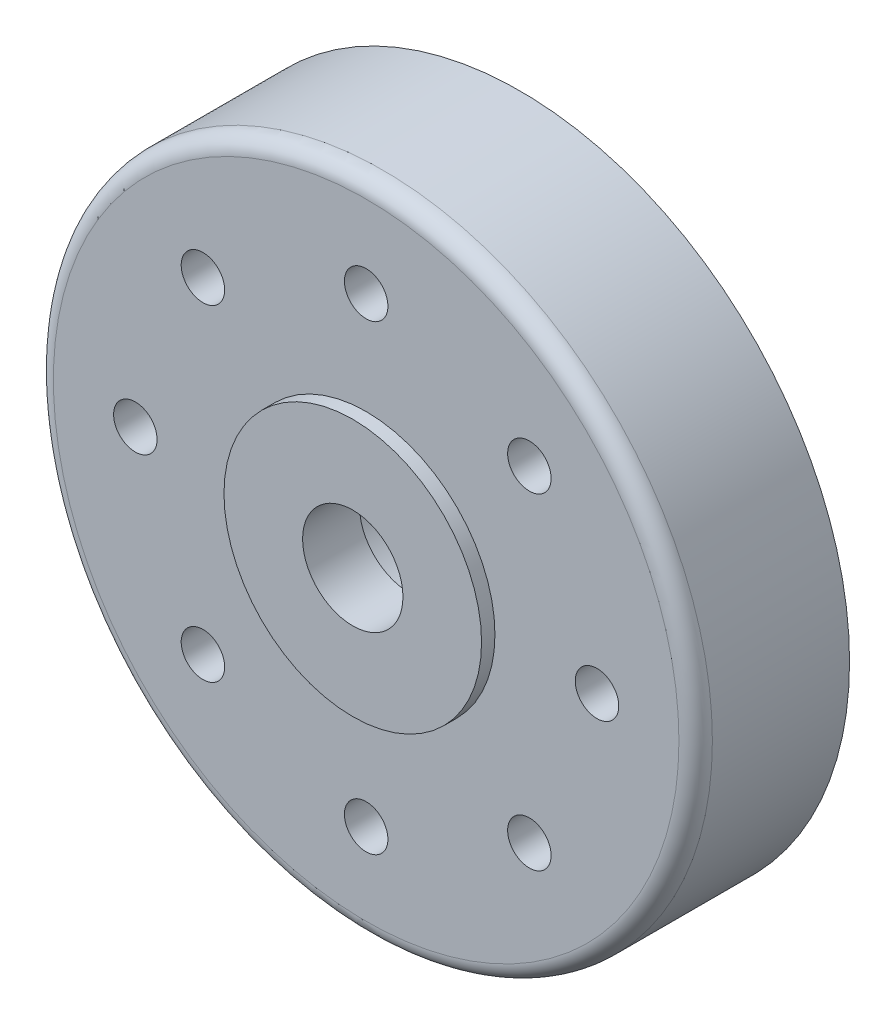
ISO-10303-21;
HEADER;
FILE_DESCRIPTION(('STEP AP214'),'2;1');
FILE_NAME('part.step','',(''),(''),'','','');
FILE_SCHEMA(('AUTOMOTIVE_DESIGN { 1 0 10303 214 1 1 1 1 }'));
ENDSEC;
DATA;
#1=APPLICATION_CONTEXT('core data for automotive mechanical design processes');
#2=APPLICATION_PROTOCOL_DEFINITION('international standard','automotive_design',2000,#1);
#3=PRODUCT_CONTEXT('',#1,'mechanical');
#4=PRODUCT('Part','Part','',(#3));
#5=PRODUCT_RELATED_PRODUCT_CATEGORY('part','',(#4));
#6=PRODUCT_DEFINITION_FORMATION('','',#4);
#7=PRODUCT_DEFINITION_CONTEXT('part definition',#1,'design');
#8=PRODUCT_DEFINITION('design','',#6,#7);
#9=PRODUCT_DEFINITION_SHAPE('','',#8);
#10=(LENGTH_UNIT() NAMED_UNIT(*) SI_UNIT(.MILLI.,.METRE.));
#11=(NAMED_UNIT(*) PLANE_ANGLE_UNIT() SI_UNIT($,.RADIAN.));
#12=(NAMED_UNIT(*) SI_UNIT($,.STERADIAN.) SOLID_ANGLE_UNIT());
#13=UNCERTAINTY_MEASURE_WITH_UNIT(LENGTH_MEASURE(1.E-05),#10,'distance_accuracy_value','');
#14=(GEOMETRIC_REPRESENTATION_CONTEXT(3) GLOBAL_UNCERTAINTY_ASSIGNED_CONTEXT((#13)) GLOBAL_UNIT_ASSIGNED_CONTEXT((#10,
#11,#12)) REPRESENTATION_CONTEXT('',''));
#15=CARTESIAN_POINT('',(0.,0.,0.));
#16=DIRECTION('',(0.,0.,1.));
#17=DIRECTION('',(1.,0.,0.));
#18=AXIS2_PLACEMENT_3D('',#15,#16,#17);
#19=CARTESIAN_POINT('',(1.23567068110566E-13,0.,5.));
#20=DIRECTION('',(0.,0.,1.));
#21=DIRECTION('',(1.,0.,0.));
#22=AXIS2_PLACEMENT_3D('',#19,#20,#21);
#23=PLANE('',#22);
#24=CARTESIAN_POINT('',(1.23567068110566E-13,0.,5.));
#25=DIRECTION('',(0.,0.,1.));
#26=DIRECTION('',(1.,0.,0.));
#27=AXIS2_PLACEMENT_3D('',#24,#25,#26);
#28=CIRCLE('',#27,1.5);
#29=CARTESIAN_POINT('',(1.50000000000012,0.,5.));
#30=VERTEX_POINT('',#29);
#31=EDGE_CURVE('E302',#30,#30,#28,.T.);
#32=ORIENTED_EDGE('',*,*,#31,.F.);
#33=EDGE_LOOP('',(#32));
#34=FACE_BOUND('',#33,.T.);
#35=CARTESIAN_POINT('',(1.23567068110566E-13,0.,5.));
#36=DIRECTION('',(0.,0.,1.));
#37=DIRECTION('',(1.,0.,0.));
#38=AXIS2_PLACEMENT_3D('',#35,#36,#37);
#39=CIRCLE('',#38,3.85);
#40=CARTESIAN_POINT('',(3.85000000000012,0.,5.));
#41=VERTEX_POINT('',#40);
#42=EDGE_CURVE('E794',#41,#41,#39,.T.);
#43=ORIENTED_EDGE('',*,*,#42,.T.);
#44=EDGE_LOOP('',(#43));
#45=FACE_BOUND('',#44,.T.);
#46=ADVANCED_FACE('F37',(#34,#45),#23,.T.);
#47=CARTESIAN_POINT('',(1.23567068110566E-13,0.,5.));
#48=DIRECTION('',(0.,0.,-1.));
#49=DIRECTION('',(-1.,0.,0.));
#50=AXIS2_PLACEMENT_3D('',#47,#48,#49);
#51=CYLINDRICAL_SURFACE('',#50,9.84999999999988);
#52=CARTESIAN_POINT('',(1.23567068110566E-13,0.,4.1));
#53=DIRECTION('',(0.,0.,1.));
#54=DIRECTION('',(1.,0.,0.));
#55=AXIS2_PLACEMENT_3D('',#52,#53,#54);
#56=CIRCLE('',#55,9.84999999999988);
#57=CARTESIAN_POINT('',(9.85,0.,4.1));
#58=VERTEX_POINT('',#57);
#59=EDGE_CURVE('E11',#58,#58,#56,.F.);
#60=ORIENTED_EDGE('',*,*,#59,.T.);
#61=EDGE_LOOP('',(#60));
#62=FACE_BOUND('',#61,.T.);
#63=CARTESIAN_POINT('',(1.23567068110566E-13,0.,0.));
#64=DIRECTION('',(0.,0.,1.));
#65=DIRECTION('',(1.,0.,0.));
#66=AXIS2_PLACEMENT_3D('',#63,#64,#65);
#67=CIRCLE('',#66,9.84999999999988);
#68=CARTESIAN_POINT('',(9.85,0.,0.));
#69=VERTEX_POINT('',#68);
#70=EDGE_CURVE('E305',#69,#69,#67,.T.);
#71=ORIENTED_EDGE('',*,*,#70,.T.);
#72=EDGE_LOOP('',(#71));
#73=FACE_BOUND('',#72,.T.);
#74=ADVANCED_FACE('F330',(#62,#73),#51,.T.);
#75=CARTESIAN_POINT('',(0.,6.9,5.));
#76=DIRECTION('',(0.,0.,-1.));
#77=DIRECTION('',(-1.,0.,0.));
#78=AXIS2_PLACEMENT_3D('',#75,#76,#77);
#79=CYLINDRICAL_SURFACE('',#78,0.65);
#80=CARTESIAN_POINT('',(0.,6.9,0.));
#81=DIRECTION('',(0.,0.,1.));
#82=DIRECTION('',(1.,0.,0.));
#83=AXIS2_PLACEMENT_3D('',#80,#81,#82);
#84=CIRCLE('',#83,0.65);
#85=CARTESIAN_POINT('',(0.65,6.9,0.));
#86=VERTEX_POINT('',#85);
#87=EDGE_CURVE('E299',#86,#86,#84,.T.);
#88=ORIENTED_EDGE('',*,*,#87,.F.);
#89=EDGE_LOOP('',(#88));
#90=FACE_BOUND('',#89,.T.);
#91=CARTESIAN_POINT('',(0.,6.9,4.6));
#92=DIRECTION('',(0.,0.,1.));
#93=DIRECTION('',(1.,0.,0.));
#94=AXIS2_PLACEMENT_3D('',#91,#92,#93);
#95=CIRCLE('',#94,0.65);
#96=CARTESIAN_POINT('',(0.65,6.9,4.6));
#97=VERTEX_POINT('',#96);
#98=EDGE_CURVE('E242',#97,#97,#95,.T.);
#99=ORIENTED_EDGE('',*,*,#98,.T.);
#100=EDGE_LOOP('',(#99));
#101=FACE_BOUND('',#100,.T.);
#102=ADVANCED_FACE('F336',(#90,#101),#79,.F.);
#103=CARTESIAN_POINT('',(4.87903679018727,4.87903679018709,5.));
#104=DIRECTION('',(0.,0.,-1.));
#105=DIRECTION('',(-1.,0.,0.));
#106=AXIS2_PLACEMENT_3D('',#103,#104,#105);
#107=CYLINDRICAL_SURFACE('',#106,0.65);
#108=CARTESIAN_POINT('',(4.87903679018727,4.87903679018709,0.));
#109=DIRECTION('',(0.,0.,1.));
#110=DIRECTION('',(1.,0.,0.));
#111=AXIS2_PLACEMENT_3D('',#108,#109,#110);
#112=CIRCLE('',#111,0.65);
#113=CARTESIAN_POINT('',(5.52903679018727,4.87903679018709,0.));
#114=VERTEX_POINT('',#113);
#115=EDGE_CURVE('E296',#114,#114,#112,.T.);
#116=ORIENTED_EDGE('',*,*,#115,.F.);
#117=EDGE_LOOP('',(#116));
#118=FACE_BOUND('',#117,.T.);
#119=CARTESIAN_POINT('',(4.87903679018727,4.87903679018709,4.6));
#120=DIRECTION('',(0.,0.,1.));
#121=DIRECTION('',(1.,0.,0.));
#122=AXIS2_PLACEMENT_3D('',#119,#120,#121);
#123=CIRCLE('',#122,0.65);
#124=CARTESIAN_POINT('',(5.52903679018727,4.87903679018709,4.6));
#125=VERTEX_POINT('',#124);
#126=EDGE_CURVE('E454',#125,#125,#123,.T.);
#127=ORIENTED_EDGE('',*,*,#126,.T.);
#128=EDGE_LOOP('',(#127));
#129=FACE_BOUND('',#128,.T.);
#130=ADVANCED_FACE('F442',(#118,#129),#107,.F.);
#131=CARTESIAN_POINT('',(6.9,-2.53907387335425E-13,5.));
#132=DIRECTION('',(0.,0.,-1.));
#133=DIRECTION('',(-1.,0.,0.));
#134=AXIS2_PLACEMENT_3D('',#131,#132,#133);
#135=CYLINDRICAL_SURFACE('',#134,0.65);
#136=CARTESIAN_POINT('',(6.9,-2.53907387335425E-13,0.));
#137=DIRECTION('',(0.,0.,1.));
#138=DIRECTION('',(1.,0.,0.));
#139=AXIS2_PLACEMENT_3D('',#136,#137,#138);
#140=CIRCLE('',#139,0.65);
#141=CARTESIAN_POINT('',(7.55,-2.53907387335425E-13,0.));
#142=VERTEX_POINT('',#141);
#143=EDGE_CURVE('E293',#142,#142,#140,.T.);
#144=ORIENTED_EDGE('',*,*,#143,.F.);
#145=EDGE_LOOP('',(#144));
#146=FACE_BOUND('',#145,.T.);
#147=CARTESIAN_POINT('',(6.9,-2.53907387335425E-13,4.6));
#148=DIRECTION('',(0.,0.,1.));
#149=DIRECTION('',(1.,0.,0.));
#150=AXIS2_PLACEMENT_3D('',#147,#148,#149);
#151=CIRCLE('',#150,0.65);
#152=CARTESIAN_POINT('',(7.55,-2.53907387335425E-13,4.6));
#153=VERTEX_POINT('',#152);
#154=EDGE_CURVE('E457',#153,#153,#151,.T.);
#155=ORIENTED_EDGE('',*,*,#154,.T.);
#156=EDGE_LOOP('',(#155));
#157=FACE_BOUND('',#156,.T.);
#158=ADVANCED_FACE('F438',(#146,#157),#135,.F.);
#159=CARTESIAN_POINT('',(4.87903679018691,-4.87903679018745,5.));
#160=DIRECTION('',(0.,0.,-1.));
#161=DIRECTION('',(-1.,0.,0.));
#162=AXIS2_PLACEMENT_3D('',#159,#160,#161);
#163=CYLINDRICAL_SURFACE('',#162,0.65);
#164=CARTESIAN_POINT('',(4.87903679018691,-4.87903679018745,0.));
#165=DIRECTION('',(0.,0.,1.));
#166=DIRECTION('',(1.,0.,0.));
#167=AXIS2_PLACEMENT_3D('',#164,#165,#166);
#168=CIRCLE('',#167,0.65);
#169=CARTESIAN_POINT('',(5.52903679018691,-4.87903679018745,0.));
#170=VERTEX_POINT('',#169);
#171=EDGE_CURVE('E290',#170,#170,#168,.T.);
#172=ORIENTED_EDGE('',*,*,#171,.F.);
#173=EDGE_LOOP('',(#172));
#174=FACE_BOUND('',#173,.T.);
#175=CARTESIAN_POINT('',(4.87903679018691,-4.87903679018745,4.6));
#176=DIRECTION('',(0.,0.,1.));
#177=DIRECTION('',(1.,0.,0.));
#178=AXIS2_PLACEMENT_3D('',#175,#176,#177);
#179=CIRCLE('',#178,0.65);
#180=CARTESIAN_POINT('',(5.52903679018691,-4.87903679018745,4.6));
#181=VERTEX_POINT('',#180);
#182=EDGE_CURVE('E783',#181,#181,#179,.T.);
#183=ORIENTED_EDGE('',*,*,#182,.T.);
#184=EDGE_LOOP('',(#183));
#185=FACE_BOUND('',#184,.T.);
#186=ADVANCED_FACE('F434',(#174,#185),#163,.F.);
#187=CARTESIAN_POINT('',(-5.0781477467085E-13,-6.9,5.));
#188=DIRECTION('',(0.,0.,-1.));
#189=DIRECTION('',(-1.,0.,0.));
#190=AXIS2_PLACEMENT_3D('',#187,#188,#189);
#191=CYLINDRICAL_SURFACE('',#190,0.65);
#192=CARTESIAN_POINT('',(-5.0781477467085E-13,-6.9,0.));
#193=DIRECTION('',(0.,0.,1.));
#194=DIRECTION('',(1.,0.,0.));
#195=AXIS2_PLACEMENT_3D('',#192,#193,#194);
#196=CIRCLE('',#195,0.65);
#197=CARTESIAN_POINT('',(0.649999999999492,-6.9,0.));
#198=VERTEX_POINT('',#197);
#199=EDGE_CURVE('E287',#198,#198,#196,.T.);
#200=ORIENTED_EDGE('',*,*,#199,.F.);
#201=EDGE_LOOP('',(#200));
#202=FACE_BOUND('',#201,.T.);
#203=CARTESIAN_POINT('',(-5.0781477467085E-13,-6.9,4.6));
#204=DIRECTION('',(0.,0.,1.));
#205=DIRECTION('',(1.,0.,0.));
#206=AXIS2_PLACEMENT_3D('',#203,#204,#205);
#207=CIRCLE('',#206,0.65);
#208=CARTESIAN_POINT('',(0.649999999999492,-6.9,4.6));
#209=VERTEX_POINT('',#208);
#210=EDGE_CURVE('E786',#209,#209,#207,.T.);
#211=ORIENTED_EDGE('',*,*,#210,.T.);
#212=EDGE_LOOP('',(#211));
#213=FACE_BOUND('',#212,.T.);
#214=ADVANCED_FACE('F430',(#202,#213),#191,.F.);
#215=CARTESIAN_POINT('',(-4.87903679018763,-4.87903679018673,5.));
#216=DIRECTION('',(0.,0.,-1.));
#217=DIRECTION('',(-1.,0.,0.));
#218=AXIS2_PLACEMENT_3D('',#215,#216,#217);
#219=CYLINDRICAL_SURFACE('',#218,0.65);
#220=CARTESIAN_POINT('',(-4.87903679018763,-4.87903679018673,0.));
#221=DIRECTION('',(0.,0.,1.));
#222=DIRECTION('',(1.,0.,0.));
#223=AXIS2_PLACEMENT_3D('',#220,#221,#222);
#224=CIRCLE('',#223,0.65);
#225=CARTESIAN_POINT('',(-4.22903679018763,-4.87903679018673,0.));
#226=VERTEX_POINT('',#225);
#227=EDGE_CURVE('E284',#226,#226,#224,.T.);
#228=ORIENTED_EDGE('',*,*,#227,.F.);
#229=EDGE_LOOP('',(#228));
#230=FACE_BOUND('',#229,.T.);
#231=CARTESIAN_POINT('',(-4.87903679018763,-4.87903679018673,4.6));
#232=DIRECTION('',(0.,0.,1.));
#233=DIRECTION('',(1.,0.,0.));
#234=AXIS2_PLACEMENT_3D('',#231,#232,#233);
#235=CIRCLE('',#234,0.65);
#236=CARTESIAN_POINT('',(-4.22903679018763,-4.87903679018673,4.6));
#237=VERTEX_POINT('',#236);
#238=EDGE_CURVE('E789',#237,#237,#235,.T.);
#239=ORIENTED_EDGE('',*,*,#238,.T.);
#240=EDGE_LOOP('',(#239));
#241=FACE_BOUND('',#240,.T.);
#242=ADVANCED_FACE('F426',(#230,#241),#219,.F.);
#243=CARTESIAN_POINT('',(-6.9,7.5865794645831E-13,5.));
#244=DIRECTION('',(0.,0.,-1.));
#245=DIRECTION('',(-1.,0.,0.));
#246=AXIS2_PLACEMENT_3D('',#243,#244,#245);
#247=CYLINDRICAL_SURFACE('',#246,0.65);
#248=CARTESIAN_POINT('',(-6.9,7.5865794645831E-13,0.));
#249=DIRECTION('',(0.,0.,1.));
#250=DIRECTION('',(1.,0.,0.));
#251=AXIS2_PLACEMENT_3D('',#248,#249,#250);
#252=CIRCLE('',#251,0.65);
#253=CARTESIAN_POINT('',(-6.25,7.5865794645831E-13,0.));
#254=VERTEX_POINT('',#253);
#255=EDGE_CURVE('E281',#254,#254,#252,.T.);
#256=ORIENTED_EDGE('',*,*,#255,.F.);
#257=EDGE_LOOP('',(#256));
#258=FACE_BOUND('',#257,.T.);
#259=CARTESIAN_POINT('',(-6.9,7.5865794645831E-13,4.6));
#260=DIRECTION('',(0.,0.,1.));
#261=DIRECTION('',(1.,0.,0.));
#262=AXIS2_PLACEMENT_3D('',#259,#260,#261);
#263=CIRCLE('',#262,0.65);
#264=CARTESIAN_POINT('',(-6.25,7.5865794645831E-13,4.6));
#265=VERTEX_POINT('',#264);
#266=EDGE_CURVE('E312',#265,#265,#263,.T.);
#267=ORIENTED_EDGE('',*,*,#266,.T.);
#268=EDGE_LOOP('',(#267));
#269=FACE_BOUND('',#268,.T.);
#270=ADVANCED_FACE('F365',(#258,#269),#247,.F.);
#271=CARTESIAN_POINT('',(-4.87903679018655,4.87903679018781,5.));
#272=DIRECTION('',(0.,0.,-1.));
#273=DIRECTION('',(-1.,0.,0.));
#274=AXIS2_PLACEMENT_3D('',#271,#272,#273);
#275=CYLINDRICAL_SURFACE('',#274,0.65);
#276=CARTESIAN_POINT('',(-4.87903679018655,4.87903679018781,0.));
#277=DIRECTION('',(0.,0.,1.));
#278=DIRECTION('',(1.,0.,0.));
#279=AXIS2_PLACEMENT_3D('',#276,#277,#278);
#280=CIRCLE('',#279,0.65);
#281=CARTESIAN_POINT('',(-4.22903679018655,4.87903679018781,0.));
#282=VERTEX_POINT('',#281);
#283=EDGE_CURVE('E278',#282,#282,#280,.T.);
#284=ORIENTED_EDGE('',*,*,#283,.F.);
#285=EDGE_LOOP('',(#284));
#286=FACE_BOUND('',#285,.T.);
#287=CARTESIAN_POINT('',(-4.87903679018655,4.87903679018781,4.6));
#288=DIRECTION('',(0.,0.,1.));
#289=DIRECTION('',(1.,0.,0.));
#290=AXIS2_PLACEMENT_3D('',#287,#288,#289);
#291=CIRCLE('',#290,0.65);
#292=CARTESIAN_POINT('',(-4.22903679018655,4.87903679018781,4.6));
#293=VERTEX_POINT('',#292);
#294=EDGE_CURVE('E310',#293,#293,#291,.T.);
#295=ORIENTED_EDGE('',*,*,#294,.T.);
#296=EDGE_LOOP('',(#295));
#297=FACE_BOUND('',#296,.T.);
#298=ADVANCED_FACE('F360',(#286,#297),#275,.F.);
#299=CARTESIAN_POINT('',(1.23567068110566E-13,0.,0.));
#300=DIRECTION('',(0.,0.,1.));
#301=DIRECTION('',(1.,0.,0.));
#302=AXIS2_PLACEMENT_3D('',#299,#300,#301);
#303=PLANE('',#302);
#304=CARTESIAN_POINT('',(0.,0.,0.));
#305=DIRECTION('',(0.,0.,1.));
#306=DIRECTION('',(1.,0.,0.));
#307=AXIS2_PLACEMENT_3D('',#304,#305,#306);
#308=CIRCLE('',#307,3.9);
#309=CARTESIAN_POINT('',(3.9,0.,0.));
#310=VERTEX_POINT('',#309);
#311=EDGE_CURVE('E212',#310,#310,#308,.F.);
#312=ORIENTED_EDGE('',*,*,#311,.T.);
#313=EDGE_LOOP('',(#312));
#314=FACE_BOUND('',#313,.T.);
#315=CARTESIAN_POINT('',(0.,0.,0.));
#316=DIRECTION('',(0.,0.,-1.));
#317=DIRECTION('',(-1.,0.,0.));
#318=AXIS2_PLACEMENT_3D('',#315,#316,#317);
#319=CIRCLE('',#318,2.5);
#320=CARTESIAN_POINT('',(-2.5,0.,0.));
#321=VERTEX_POINT('',#320);
#322=EDGE_CURVE('E271',#321,#321,#319,.T.);
#323=ORIENTED_EDGE('',*,*,#322,.F.);
#324=EDGE_LOOP('',(#323));
#325=FACE_BOUND('',#324,.T.);
#326=ADVANCED_FACE('F348',(#314,#325),#303,.F.);
#327=CARTESIAN_POINT('',(1.23567068110566E-13,0.,5.));
#328=DIRECTION('',(0.,0.,-1.));
#329=DIRECTION('',(-1.,0.,0.));
#330=AXIS2_PLACEMENT_3D('',#327,#328,#329);
#331=CYLINDRICAL_SURFACE('',#330,1.5);
#332=ORIENTED_EDGE('',*,*,#31,.T.);
#333=EDGE_LOOP('',(#332));
#334=FACE_BOUND('',#333,.T.);
#335=CARTESIAN_POINT('',(1.23567068110566E-13,0.,3.3));
#336=DIRECTION('',(0.,0.,-1.));
#337=DIRECTION('',(-1.,0.,0.));
#338=AXIS2_PLACEMENT_3D('',#335,#336,#337);
#339=CIRCLE('',#338,1.5);
#340=CARTESIAN_POINT('',(-1.49999999999988,0.,3.3));
#341=VERTEX_POINT('',#340);
#342=EDGE_CURVE('E275',#341,#341,#339,.T.);
#343=ORIENTED_EDGE('',*,*,#342,.T.);
#344=EDGE_LOOP('',(#343));
#345=FACE_BOUND('',#344,.T.);
#346=ADVANCED_FACE('F342',(#334,#345),#331,.F.);
#347=CARTESIAN_POINT('',(4.87903679018727,4.87903679018709,0.));
#348=DIRECTION('',(0.,0.,1.));
#349=DIRECTION('',(1.,0.,0.));
#350=AXIS2_PLACEMENT_3D('',#347,#348,#349);
#351=CIRCLE('',#350,2.05);
#352=CARTESIAN_POINT('',(4.83703548901984,6.92860647446236,0.));
#353=VERTEX_POINT('',#352);
#354=CARTESIAN_POINT('',(6.92860647446254,4.83703548901964,0.));
#355=VERTEX_POINT('',#354);
#356=EDGE_CURVE('E224',#353,#355,#351,.T.);
#357=ORIENTED_EDGE('',*,*,#356,.F.);
#358=CARTESIAN_POINT('',(1.23567068110566E-13,0.,0.));
#359=DIRECTION('',(0.,0.,1.));
#360=DIRECTION('',(1.,0.,0.));
#361=AXIS2_PLACEMENT_3D('',#358,#359,#360);
#362=CIRCLE('',#361,8.44999999999988);
#363=CARTESIAN_POINT('',(1.47896402713965,8.31956521739118,0.));
#364=VERTEX_POINT('',#363);
#365=EDGE_CURVE('E188',#353,#364,#362,.T.);
#366=ORIENTED_EDGE('',*,*,#365,.T.);
#367=CARTESIAN_POINT('',(0.,6.9,0.));
#368=DIRECTION('',(0.,0.,1.));
#369=DIRECTION('',(1.,0.,0.));
#370=AXIS2_PLACEMENT_3D('',#367,#368,#369);
#371=CIRCLE('',#370,2.05);
#372=CARTESIAN_POINT('',(-1.4789640271397,8.31956521739113,0.));
#373=VERTEX_POINT('',#372);
#374=EDGE_CURVE('E220',#373,#364,#371,.T.);
#375=ORIENTED_EDGE('',*,*,#374,.F.);
#376=CARTESIAN_POINT('',(-4.83703548901858,6.92860647446307,0.));
#377=VERTEX_POINT('',#376);
#378=EDGE_CURVE('E52',#373,#377,#362,.T.);
#379=ORIENTED_EDGE('',*,*,#378,.T.);
#380=CARTESIAN_POINT('',(-4.87903679018655,4.87903679018781,0.));
#381=DIRECTION('',(0.,0.,1.));
#382=DIRECTION('',(1.,0.,0.));
#383=AXIS2_PLACEMENT_3D('',#380,#381,#382);
#384=CIRCLE('',#383,2.05);
#385=CARTESIAN_POINT('',(-6.92860647446182,4.83703548902031,0.));
#386=VERTEX_POINT('',#385);
#387=EDGE_CURVE('E209',#386,#377,#384,.T.);
#388=ORIENTED_EDGE('',*,*,#387,.F.);
#389=CARTESIAN_POINT('',(-8.31956521739085,1.47896402714073,0.));
#390=VERTEX_POINT('',#389);
#391=EDGE_CURVE('E464',#386,#390,#362,.T.);
#392=ORIENTED_EDGE('',*,*,#391,.T.);
#393=CARTESIAN_POINT('',(-6.9,7.5865794645831E-13,0.));
#394=DIRECTION('',(0.,0.,1.));
#395=DIRECTION('',(1.,0.,0.));
#396=AXIS2_PLACEMENT_3D('',#393,#394,#395);
#397=CIRCLE('',#396,2.05);
#398=CARTESIAN_POINT('',(-8.31956521739117,-1.4789640271389,0.));
#399=VERTEX_POINT('',#398);
#400=EDGE_CURVE('E169',#399,#390,#397,.T.);
#401=ORIENTED_EDGE('',*,*,#400,.F.);
#402=CARTESIAN_POINT('',(-6.92860647446289,-4.83703548901878,0.));
#403=VERTEX_POINT('',#402);
#404=EDGE_CURVE('E155',#399,#403,#362,.T.);
#405=ORIENTED_EDGE('',*,*,#404,.T.);
#406=CARTESIAN_POINT('',(-4.87903679018763,-4.87903679018673,0.));
#407=DIRECTION('',(0.,0.,1.));
#408=DIRECTION('',(1.,0.,0.));
#409=AXIS2_PLACEMENT_3D('',#406,#407,#408);
#410=CIRCLE('',#409,2.05);
#411=CARTESIAN_POINT('',(-4.83703548902011,-6.928606474462,0.));
#412=VERTEX_POINT('',#411);
#413=EDGE_CURVE('E168',#412,#403,#410,.T.);
#414=ORIENTED_EDGE('',*,*,#413,.F.);
#415=CARTESIAN_POINT('',(-1.47896402714031,-8.31956521739102,0.));
#416=VERTEX_POINT('',#415);
#417=EDGE_CURVE('E469',#412,#416,#362,.T.);
#418=ORIENTED_EDGE('',*,*,#417,.T.);
#419=CARTESIAN_POINT('',(-5.0781477467085E-13,-6.9,0.));
#420=DIRECTION('',(0.,0.,1.));
#421=DIRECTION('',(1.,0.,0.));
#422=AXIS2_PLACEMENT_3D('',#419,#420,#421);
#423=CIRCLE('',#422,2.05);
#424=CARTESIAN_POINT('',(1.47896402713903,-8.31956521739129,0.));
#425=VERTEX_POINT('',#424);
#426=EDGE_CURVE('E236',#425,#416,#423,.T.);
#427=ORIENTED_EDGE('',*,*,#426,.F.);
#428=CARTESIAN_POINT('',(4.83703548901934,-6.92860647446272,0.));
#429=VERTEX_POINT('',#428);
#430=EDGE_CURVE('E472',#425,#429,#362,.T.);
#431=ORIENTED_EDGE('',*,*,#430,.T.);
#432=CARTESIAN_POINT('',(4.87903679018691,-4.87903679018745,0.));
#433=DIRECTION('',(0.,0.,1.));
#434=DIRECTION('',(1.,0.,0.));
#435=AXIS2_PLACEMENT_3D('',#432,#433,#434);
#436=CIRCLE('',#435,2.05);
#437=CARTESIAN_POINT('',(6.92860647446219,-4.83703548902015,0.));
#438=VERTEX_POINT('',#437);
#439=EDGE_CURVE('E232',#438,#429,#436,.T.);
#440=ORIENTED_EDGE('',*,*,#439,.F.);
#441=CARTESIAN_POINT('',(8.31956521739125,-1.47896402713983,0.));
#442=VERTEX_POINT('',#441);
#443=EDGE_CURVE('E476',#438,#442,#362,.T.);
#444=ORIENTED_EDGE('',*,*,#443,.T.);
#445=CARTESIAN_POINT('',(6.9,-2.53907387335425E-13,0.));
#446=DIRECTION('',(0.,0.,1.));
#447=DIRECTION('',(1.,0.,0.));
#448=AXIS2_PLACEMENT_3D('',#445,#446,#447);
#449=CIRCLE('',#448,2.05);
#450=CARTESIAN_POINT('',(8.31956521739136,1.47896402713922,0.));
#451=VERTEX_POINT('',#450);
#452=EDGE_CURVE('E228',#451,#442,#449,.T.);
#453=ORIENTED_EDGE('',*,*,#452,.F.);
#454=EDGE_CURVE('E219',#451,#355,#362,.T.);
#455=ORIENTED_EDGE('',*,*,#454,.T.);
#456=EDGE_LOOP('',(#357,#366,#375,#379,#388,#392,#401,#405,#414,#418,#427,#431,#440,#444,#453,#455));
#457=FACE_BOUND('',#456,.T.);
#458=ORIENTED_EDGE('',*,*,#70,.F.);
#459=EDGE_LOOP('',(#458));
#460=FACE_BOUND('',#459,.T.);
#461=ORIENTED_EDGE('',*,*,#87,.T.);
#462=EDGE_LOOP('',(#461));
#463=FACE_BOUND('',#462,.T.);
#464=ORIENTED_EDGE('',*,*,#115,.T.);
#465=EDGE_LOOP('',(#464));
#466=FACE_BOUND('',#465,.T.);
#467=ORIENTED_EDGE('',*,*,#143,.T.);
#468=EDGE_LOOP('',(#467));
#469=FACE_BOUND('',#468,.T.);
#470=ORIENTED_EDGE('',*,*,#171,.T.);
#471=EDGE_LOOP('',(#470));
#472=FACE_BOUND('',#471,.T.);
#473=ORIENTED_EDGE('',*,*,#199,.T.);
#474=EDGE_LOOP('',(#473));
#475=FACE_BOUND('',#474,.T.);
#476=ORIENTED_EDGE('',*,*,#227,.T.);
#477=EDGE_LOOP('',(#476));
#478=FACE_BOUND('',#477,.T.);
#479=ORIENTED_EDGE('',*,*,#255,.T.);
#480=EDGE_LOOP('',(#479));
#481=FACE_BOUND('',#480,.T.);
#482=ORIENTED_EDGE('',*,*,#283,.T.);
#483=EDGE_LOOP('',(#482));
#484=FACE_BOUND('',#483,.T.);
#485=ADVANCED_FACE('F344',(#457,#460,#463,#466,#469,#472,#475,#478,#481,#484),#303,.F.);
#486=CARTESIAN_POINT('',(0.,0.,3.3));
#487=DIRECTION('',(0.,0.,-1.));
#488=DIRECTION('',(-1.,0.,0.));
#489=AXIS2_PLACEMENT_3D('',#486,#487,#488);
#490=CYLINDRICAL_SURFACE('',#489,2.5);
#491=CARTESIAN_POINT('',(0.,0.,3.3));
#492=DIRECTION('',(0.,0.,-1.));
#493=DIRECTION('',(-1.,0.,0.));
#494=AXIS2_PLACEMENT_3D('',#491,#492,#493);
#495=CIRCLE('',#494,2.5);
#496=CARTESIAN_POINT('',(-2.5,0.,3.3));
#497=VERTEX_POINT('',#496);
#498=EDGE_CURVE('E272',#497,#497,#495,.T.);
#499=ORIENTED_EDGE('',*,*,#498,.F.);
#500=EDGE_LOOP('',(#499));
#501=FACE_BOUND('',#500,.T.);
#502=ORIENTED_EDGE('',*,*,#322,.T.);
#503=EDGE_LOOP('',(#502));
#504=FACE_BOUND('',#503,.T.);
#505=ADVANCED_FACE('F346',(#501,#504),#490,.F.);
#506=CARTESIAN_POINT('',(0.,0.,3.3));
#507=DIRECTION('',(0.,0.,-1.));
#508=DIRECTION('',(-1.,0.,0.));
#509=AXIS2_PLACEMENT_3D('',#506,#507,#508);
#510=PLANE('',#509);
#511=ORIENTED_EDGE('',*,*,#342,.F.);
#512=EDGE_LOOP('',(#511));
#513=FACE_BOUND('',#512,.T.);
#514=ORIENTED_EDGE('',*,*,#498,.T.);
#515=EDGE_LOOP('',(#514));
#516=FACE_BOUND('',#515,.T.);
#517=ADVANCED_FACE('F353',(#513,#516),#510,.T.);
#518=CARTESIAN_POINT('',(0.,0.,3.3));
#519=DIRECTION('',(0.,0.,-1.));
#520=DIRECTION('',(-1.,0.,0.));
#521=AXIS2_PLACEMENT_3D('',#518,#519,#520);
#522=CYLINDRICAL_SURFACE('',#521,3.9);
#523=ORIENTED_EDGE('',*,*,#311,.F.);
#524=EDGE_LOOP('',(#523));
#525=FACE_BOUND('',#524,.T.);
#526=CARTESIAN_POINT('',(0.,0.,3.6));
#527=DIRECTION('',(0.,0.,1.));
#528=DIRECTION('',(1.,0.,0.));
#529=AXIS2_PLACEMENT_3D('',#526,#527,#528);
#530=CIRCLE('',#529,3.9);
#531=CARTESIAN_POINT('',(3.9,0.,3.6));
#532=VERTEX_POINT('',#531);
#533=EDGE_CURVE('E268',#532,#532,#530,.T.);
#534=ORIENTED_EDGE('',*,*,#533,.F.);
#535=EDGE_LOOP('',(#534));
#536=FACE_BOUND('',#535,.T.);
#537=ADVANCED_FACE('F373',(#525,#536),#522,.T.);
#538=CARTESIAN_POINT('',(1.23567068110566E-13,0.,5.));
#539=DIRECTION('',(0.,0.,-1.));
#540=DIRECTION('',(-1.,0.,0.));
#541=AXIS2_PLACEMENT_3D('',#538,#539,#540);
#542=CYLINDRICAL_SURFACE('',#541,8.44999999999988);
#543=DIRECTION('',(0.,0.,-1.));
#544=VECTOR('',#543,1.);
#545=CARTESIAN_POINT('',(1.47896402713965,8.31956521739118,5.));
#546=LINE('',#545,#544);
#547=CARTESIAN_POINT('',(1.47896402713965,8.31956521739118,3.6));
#548=VERTEX_POINT('',#547);
#549=EDGE_CURVE('E266',#548,#364,#546,.T.);
#550=ORIENTED_EDGE('',*,*,#549,.T.);
#551=ORIENTED_EDGE('',*,*,#365,.F.);
#552=DIRECTION('',(0.,0.,-1.));
#553=VECTOR('',#552,1.);
#554=CARTESIAN_POINT('',(4.83703548901984,6.92860647446236,5.));
#555=LINE('',#554,#553);
#556=CARTESIAN_POINT('',(4.83703548901984,6.92860647446236,3.6));
#557=VERTEX_POINT('',#556);
#558=EDGE_CURVE('E263',#557,#353,#555,.T.);
#559=ORIENTED_EDGE('',*,*,#558,.F.);
#560=CARTESIAN_POINT('',(1.23567068110566E-13,0.,3.6));
#561=DIRECTION('',(0.,0.,1.));
#562=DIRECTION('',(1.,0.,0.));
#563=AXIS2_PLACEMENT_3D('',#560,#561,#562);
#564=CIRCLE('',#563,8.44999999999988);
#565=EDGE_CURVE('E194',#557,#548,#564,.T.);
#566=ORIENTED_EDGE('',*,*,#565,.T.);
#567=EDGE_LOOP('',(#550,#551,#559,#566));
#568=FACE_BOUND('',#567,.T.);
#569=ADVANCED_FACE('F376',(#568),#542,.F.);
#570=CARTESIAN_POINT('',(-1.4789640271397,8.31956521739113,3.6));
#571=VERTEX_POINT('',#570);
#572=CARTESIAN_POINT('',(-4.83703548901858,6.92860647446307,3.6));
#573=VERTEX_POINT('',#572);
#574=EDGE_CURVE('E187',#571,#573,#564,.T.);
#575=ORIENTED_EDGE('',*,*,#574,.T.);
#576=DIRECTION('',(0.,0.,-1.));
#577=VECTOR('',#576,1.);
#578=CARTESIAN_POINT('',(-4.83703548901858,6.92860647446307,5.));
#579=LINE('',#578,#577);
#580=EDGE_CURVE('E57',#573,#377,#579,.T.);
#581=ORIENTED_EDGE('',*,*,#580,.T.);
#582=ORIENTED_EDGE('',*,*,#378,.F.);
#583=DIRECTION('',(0.,0.,-1.));
#584=VECTOR('',#583,1.);
#585=CARTESIAN_POINT('',(-1.4789640271397,8.31956521739113,5.));
#586=LINE('',#585,#584);
#587=EDGE_CURVE('E200',#571,#373,#586,.T.);
#588=ORIENTED_EDGE('',*,*,#587,.F.);
#589=EDGE_LOOP('',(#575,#581,#582,#588));
#590=FACE_BOUND('',#589,.T.);
#591=ADVANCED_FACE('F199',(#590),#542,.F.);
#592=DIRECTION('',(0.,0.,-1.));
#593=VECTOR('',#592,1.);
#594=CARTESIAN_POINT('',(6.92860647446254,4.83703548901963,5.));
#595=LINE('',#594,#593);
#596=CARTESIAN_POINT('',(6.92860647446254,4.83703548901964,3.6));
#597=VERTEX_POINT('',#596);
#598=EDGE_CURVE('E261',#597,#355,#595,.T.);
#599=ORIENTED_EDGE('',*,*,#598,.T.);
#600=ORIENTED_EDGE('',*,*,#454,.F.);
#601=DIRECTION('',(0.,0.,-1.));
#602=VECTOR('',#601,1.);
#603=CARTESIAN_POINT('',(8.31956521739136,1.47896402713922,5.));
#604=LINE('',#603,#602);
#605=CARTESIAN_POINT('',(8.31956521739136,1.47896402713922,3.6));
#606=VERTEX_POINT('',#605);
#607=EDGE_CURVE('E259',#606,#451,#604,.T.);
#608=ORIENTED_EDGE('',*,*,#607,.F.);
#609=EDGE_CURVE('E190',#606,#597,#564,.T.);
#610=ORIENTED_EDGE('',*,*,#609,.T.);
#611=EDGE_LOOP('',(#599,#600,#608,#610));
#612=FACE_BOUND('',#611,.T.);
#613=ADVANCED_FACE('F484',(#612),#542,.F.);
#614=DIRECTION('',(0.,0.,-1.));
#615=VECTOR('',#614,1.);
#616=CARTESIAN_POINT('',(8.31956521739125,-1.47896402713984,5.));
#617=LINE('',#616,#615);
#618=CARTESIAN_POINT('',(8.31956521739125,-1.47896402713983,3.6));
#619=VERTEX_POINT('',#618);
#620=EDGE_CURVE('E257',#619,#442,#617,.T.);
#621=ORIENTED_EDGE('',*,*,#620,.T.);
#622=ORIENTED_EDGE('',*,*,#443,.F.);
#623=DIRECTION('',(0.,0.,-1.));
#624=VECTOR('',#623,1.);
#625=CARTESIAN_POINT('',(6.92860647446219,-4.83703548902015,5.));
#626=LINE('',#625,#624);
#627=CARTESIAN_POINT('',(6.92860647446219,-4.83703548902015,3.6));
#628=VERTEX_POINT('',#627);
#629=EDGE_CURVE('E255',#628,#438,#626,.T.);
#630=ORIENTED_EDGE('',*,*,#629,.F.);
#631=EDGE_CURVE('E184',#628,#619,#564,.T.);
#632=ORIENTED_EDGE('',*,*,#631,.T.);
#633=EDGE_LOOP('',(#621,#622,#630,#632));
#634=FACE_BOUND('',#633,.T.);
#635=ADVANCED_FACE('F500',(#634),#542,.F.);
#636=DIRECTION('',(0.,0.,-1.));
#637=VECTOR('',#636,1.);
#638=CARTESIAN_POINT('',(4.83703548901934,-6.92860647446271,5.));
#639=LINE('',#638,#637);
#640=CARTESIAN_POINT('',(4.83703548901934,-6.92860647446272,3.6));
#641=VERTEX_POINT('',#640);
#642=EDGE_CURVE('E253',#641,#429,#639,.T.);
#643=ORIENTED_EDGE('',*,*,#642,.T.);
#644=ORIENTED_EDGE('',*,*,#430,.F.);
#645=DIRECTION('',(0.,0.,-1.));
#646=VECTOR('',#645,1.);
#647=CARTESIAN_POINT('',(1.47896402713903,-8.31956521739129,5.));
#648=LINE('',#647,#646);
#649=CARTESIAN_POINT('',(1.47896402713903,-8.31956521739129,3.6));
#650=VERTEX_POINT('',#649);
#651=EDGE_CURVE('E251',#650,#425,#648,.T.);
#652=ORIENTED_EDGE('',*,*,#651,.F.);
#653=EDGE_CURVE('E180',#650,#641,#564,.T.);
#654=ORIENTED_EDGE('',*,*,#653,.T.);
#655=EDGE_LOOP('',(#643,#644,#652,#654));
#656=FACE_BOUND('',#655,.T.);
#657=ADVANCED_FACE('F493',(#656),#542,.F.);
#658=DIRECTION('',(0.,0.,-1.));
#659=VECTOR('',#658,1.);
#660=CARTESIAN_POINT('',(-1.47896402714031,-8.31956521739102,5.));
#661=LINE('',#660,#659);
#662=CARTESIAN_POINT('',(-1.47896402714031,-8.31956521739102,3.6));
#663=VERTEX_POINT('',#662);
#664=EDGE_CURVE('E249',#663,#416,#661,.T.);
#665=ORIENTED_EDGE('',*,*,#664,.T.);
#666=ORIENTED_EDGE('',*,*,#417,.F.);
#667=DIRECTION('',(0.,0.,-1.));
#668=VECTOR('',#667,1.);
#669=CARTESIAN_POINT('',(-4.83703548902011,-6.928606474462,5.));
#670=LINE('',#669,#668);
#671=CARTESIAN_POINT('',(-4.83703548902011,-6.928606474462,3.6));
#672=VERTEX_POINT('',#671);
#673=EDGE_CURVE('E247',#672,#412,#670,.T.);
#674=ORIENTED_EDGE('',*,*,#673,.F.);
#675=EDGE_CURVE('E177',#672,#663,#564,.T.);
#676=ORIENTED_EDGE('',*,*,#675,.T.);
#677=EDGE_LOOP('',(#665,#666,#674,#676));
#678=FACE_BOUND('',#677,.T.);
#679=ADVANCED_FACE('F390',(#678),#542,.F.);
#680=DIRECTION('',(0.,0.,-1.));
#681=VECTOR('',#680,1.);
#682=CARTESIAN_POINT('',(-6.92860647446289,-4.83703548901878,5.));
#683=LINE('',#682,#681);
#684=CARTESIAN_POINT('',(-6.92860647446289,-4.83703548901878,3.6));
#685=VERTEX_POINT('',#684);
#686=EDGE_CURVE('E159',#685,#403,#683,.T.);
#687=ORIENTED_EDGE('',*,*,#686,.T.);
#688=ORIENTED_EDGE('',*,*,#404,.F.);
#689=DIRECTION('',(0.,0.,-1.));
#690=VECTOR('',#689,1.);
#691=CARTESIAN_POINT('',(-8.31956521739117,-1.4789640271389,5.));
#692=LINE('',#691,#690);
#693=CARTESIAN_POINT('',(-8.31956521739117,-1.4789640271389,3.6));
#694=VERTEX_POINT('',#693);
#695=EDGE_CURVE('E149',#694,#399,#692,.T.);
#696=ORIENTED_EDGE('',*,*,#695,.F.);
#697=EDGE_CURVE('E153',#694,#685,#564,.T.);
#698=ORIENTED_EDGE('',*,*,#697,.T.);
#699=EDGE_LOOP('',(#687,#688,#696,#698));
#700=FACE_BOUND('',#699,.T.);
#701=ADVANCED_FACE('F151',(#700),#542,.F.);
#702=CARTESIAN_POINT('',(1.23567068110566E-13,0.,3.6));
#703=DIRECTION('',(0.,0.,1.));
#704=DIRECTION('',(1.,0.,0.));
#705=AXIS2_PLACEMENT_3D('',#702,#703,#704);
#706=PLANE('',#705);
#707=ORIENTED_EDGE('',*,*,#533,.T.);
#708=EDGE_LOOP('',(#707));
#709=FACE_BOUND('',#708,.T.);
#710=ORIENTED_EDGE('',*,*,#574,.F.);
#711=CARTESIAN_POINT('',(0.,6.9,3.6));
#712=DIRECTION('',(0.,0.,1.));
#713=DIRECTION('',(1.,0.,0.));
#714=AXIS2_PLACEMENT_3D('',#711,#712,#713);
#715=CIRCLE('',#714,2.05);
#716=EDGE_CURVE('E205',#571,#548,#715,.T.);
#717=ORIENTED_EDGE('',*,*,#716,.T.);
#718=ORIENTED_EDGE('',*,*,#565,.F.);
#719=CARTESIAN_POINT('',(4.87903679018727,4.87903679018709,3.6));
#720=DIRECTION('',(0.,0.,1.));
#721=DIRECTION('',(1.,0.,0.));
#722=AXIS2_PLACEMENT_3D('',#719,#720,#721);
#723=CIRCLE('',#722,2.05);
#724=EDGE_CURVE('E223',#557,#597,#723,.T.);
#725=ORIENTED_EDGE('',*,*,#724,.T.);
#726=ORIENTED_EDGE('',*,*,#609,.F.);
#727=CARTESIAN_POINT('',(6.9,-2.53907387335425E-13,3.6));
#728=DIRECTION('',(0.,0.,1.));
#729=DIRECTION('',(1.,0.,0.));
#730=AXIS2_PLACEMENT_3D('',#727,#728,#729);
#731=CIRCLE('',#730,2.05);
#732=EDGE_CURVE('E227',#606,#619,#731,.T.);
#733=ORIENTED_EDGE('',*,*,#732,.T.);
#734=ORIENTED_EDGE('',*,*,#631,.F.);
#735=CARTESIAN_POINT('',(4.87903679018691,-4.87903679018745,3.6));
#736=DIRECTION('',(0.,0.,1.));
#737=DIRECTION('',(1.,0.,0.));
#738=AXIS2_PLACEMENT_3D('',#735,#736,#737);
#739=CIRCLE('',#738,2.05);
#740=EDGE_CURVE('E231',#628,#641,#739,.T.);
#741=ORIENTED_EDGE('',*,*,#740,.T.);
#742=ORIENTED_EDGE('',*,*,#653,.F.);
#743=CARTESIAN_POINT('',(-5.0781477467085E-13,-6.9,3.6));
#744=DIRECTION('',(0.,0.,1.));
#745=DIRECTION('',(1.,0.,0.));
#746=AXIS2_PLACEMENT_3D('',#743,#744,#745);
#747=CIRCLE('',#746,2.05);
#748=EDGE_CURVE('E235',#650,#663,#747,.T.);
#749=ORIENTED_EDGE('',*,*,#748,.T.);
#750=ORIENTED_EDGE('',*,*,#675,.F.);
#751=CARTESIAN_POINT('',(-4.87903679018763,-4.87903679018673,3.6));
#752=DIRECTION('',(0.,0.,1.));
#753=DIRECTION('',(1.,0.,0.));
#754=AXIS2_PLACEMENT_3D('',#751,#752,#753);
#755=CIRCLE('',#754,2.05);
#756=EDGE_CURVE('E176',#672,#685,#755,.T.);
#757=ORIENTED_EDGE('',*,*,#756,.T.);
#758=ORIENTED_EDGE('',*,*,#697,.F.);
#759=CARTESIAN_POINT('',(-6.9,7.5865794645831E-13,3.6));
#760=DIRECTION('',(0.,0.,1.));
#761=DIRECTION('',(1.,0.,0.));
#762=AXIS2_PLACEMENT_3D('',#759,#760,#761);
#763=CIRCLE('',#762,2.05);
#764=CARTESIAN_POINT('',(-8.31956521739085,1.47896402714073,3.6));
#765=VERTEX_POINT('',#764);
#766=EDGE_CURVE('E163',#694,#765,#763,.T.);
#767=ORIENTED_EDGE('',*,*,#766,.T.);
#768=CARTESIAN_POINT('',(-6.92860647446182,4.83703548902031,3.6));
#769=VERTEX_POINT('',#768);
#770=EDGE_CURVE('E179',#769,#765,#564,.T.);
#771=ORIENTED_EDGE('',*,*,#770,.F.);
#772=CARTESIAN_POINT('',(-4.87903679018655,4.87903679018781,3.6));
#773=DIRECTION('',(0.,0.,1.));
#774=DIRECTION('',(1.,0.,0.));
#775=AXIS2_PLACEMENT_3D('',#772,#773,#774);
#776=CIRCLE('',#775,2.05);
#777=EDGE_CURVE('E207',#769,#573,#776,.T.);
#778=ORIENTED_EDGE('',*,*,#777,.T.);
#779=EDGE_LOOP('',(#710,#717,#718,#725,#726,#733,#734,#741,#742,#749,#750,#757,#758,#767,#771,#778));
#780=FACE_BOUND('',#779,.T.);
#781=ADVANCED_FACE('F173',(#709,#780),#706,.F.);
#782=DIRECTION('',(0.,0.,-1.));
#783=VECTOR('',#782,1.);
#784=CARTESIAN_POINT('',(-8.31956521739085,1.47896402714072,5.));
#785=LINE('',#784,#783);
#786=EDGE_CURVE('E160',#765,#390,#785,.T.);
#787=ORIENTED_EDGE('',*,*,#786,.T.);
#788=ORIENTED_EDGE('',*,*,#391,.F.);
#789=DIRECTION('',(0.,0.,-1.));
#790=VECTOR('',#789,1.);
#791=CARTESIAN_POINT('',(-6.92860647446182,4.83703548902031,5.));
#792=LINE('',#791,#790);
#793=EDGE_CURVE('E181',#769,#386,#792,.T.);
#794=ORIENTED_EDGE('',*,*,#793,.F.);
#795=ORIENTED_EDGE('',*,*,#770,.T.);
#796=EDGE_LOOP('',(#787,#788,#794,#795));
#797=FACE_BOUND('',#796,.T.);
#798=ADVANCED_FACE('F381',(#797),#542,.F.);
#799=CARTESIAN_POINT('',(0.,6.9,5.));
#800=DIRECTION('',(0.,0.,-1.));
#801=DIRECTION('',(-1.,0.,0.));
#802=AXIS2_PLACEMENT_3D('',#799,#800,#801);
#803=CYLINDRICAL_SURFACE('',#802,2.05);
#804=ORIENTED_EDGE('',*,*,#716,.F.);
#805=ORIENTED_EDGE('',*,*,#587,.T.);
#806=ORIENTED_EDGE('',*,*,#374,.T.);
#807=ORIENTED_EDGE('',*,*,#549,.F.);
#808=EDGE_LOOP('',(#804,#805,#806,#807));
#809=FACE_BOUND('',#808,.T.);
#810=ADVANCED_FACE('F387',(#809),#803,.T.);
#811=CARTESIAN_POINT('',(4.87903679018727,4.87903679018709,5.));
#812=DIRECTION('',(0.,0.,-1.));
#813=DIRECTION('',(-1.,0.,0.));
#814=AXIS2_PLACEMENT_3D('',#811,#812,#813);
#815=CYLINDRICAL_SURFACE('',#814,2.05);
#816=ORIENTED_EDGE('',*,*,#558,.T.);
#817=ORIENTED_EDGE('',*,*,#356,.T.);
#818=ORIENTED_EDGE('',*,*,#598,.F.);
#819=ORIENTED_EDGE('',*,*,#724,.F.);
#820=EDGE_LOOP('',(#816,#817,#818,#819));
#821=FACE_BOUND('',#820,.T.);
#822=ADVANCED_FACE('F395',(#821),#815,.T.);
#823=CARTESIAN_POINT('',(6.9,-2.53907387335425E-13,5.));
#824=DIRECTION('',(0.,0.,-1.));
#825=DIRECTION('',(-1.,0.,0.));
#826=AXIS2_PLACEMENT_3D('',#823,#824,#825);
#827=CYLINDRICAL_SURFACE('',#826,2.05);
#828=ORIENTED_EDGE('',*,*,#607,.T.);
#829=ORIENTED_EDGE('',*,*,#452,.T.);
#830=ORIENTED_EDGE('',*,*,#620,.F.);
#831=ORIENTED_EDGE('',*,*,#732,.F.);
#832=EDGE_LOOP('',(#828,#829,#830,#831));
#833=FACE_BOUND('',#832,.T.);
#834=ADVANCED_FACE('F399',(#833),#827,.T.);
#835=CARTESIAN_POINT('',(4.87903679018691,-4.87903679018745,5.));
#836=DIRECTION('',(0.,0.,-1.));
#837=DIRECTION('',(-1.,0.,0.));
#838=AXIS2_PLACEMENT_3D('',#835,#836,#837);
#839=CYLINDRICAL_SURFACE('',#838,2.05);
#840=ORIENTED_EDGE('',*,*,#629,.T.);
#841=ORIENTED_EDGE('',*,*,#439,.T.);
#842=ORIENTED_EDGE('',*,*,#642,.F.);
#843=ORIENTED_EDGE('',*,*,#740,.F.);
#844=EDGE_LOOP('',(#840,#841,#842,#843));
#845=FACE_BOUND('',#844,.T.);
#846=ADVANCED_FACE('F403',(#845),#839,.T.);
#847=CARTESIAN_POINT('',(-5.0781477467085E-13,-6.9,5.));
#848=DIRECTION('',(0.,0.,-1.));
#849=DIRECTION('',(-1.,0.,0.));
#850=AXIS2_PLACEMENT_3D('',#847,#848,#849);
#851=CYLINDRICAL_SURFACE('',#850,2.05);
#852=ORIENTED_EDGE('',*,*,#651,.T.);
#853=ORIENTED_EDGE('',*,*,#426,.T.);
#854=ORIENTED_EDGE('',*,*,#664,.F.);
#855=ORIENTED_EDGE('',*,*,#748,.F.);
#856=EDGE_LOOP('',(#852,#853,#854,#855));
#857=FACE_BOUND('',#856,.T.);
#858=ADVANCED_FACE('F407',(#857),#851,.T.);
#859=CARTESIAN_POINT('',(-4.87903679018763,-4.87903679018673,5.));
#860=DIRECTION('',(0.,0.,-1.));
#861=DIRECTION('',(-1.,0.,0.));
#862=AXIS2_PLACEMENT_3D('',#859,#860,#861);
#863=CYLINDRICAL_SURFACE('',#862,2.05);
#864=ORIENTED_EDGE('',*,*,#673,.T.);
#865=ORIENTED_EDGE('',*,*,#413,.T.);
#866=ORIENTED_EDGE('',*,*,#686,.F.);
#867=ORIENTED_EDGE('',*,*,#756,.F.);
#868=EDGE_LOOP('',(#864,#865,#866,#867));
#869=FACE_BOUND('',#868,.T.);
#870=ADVANCED_FACE('F411',(#869),#863,.T.);
#871=CARTESIAN_POINT('',(-6.9,7.5865794645831E-13,5.));
#872=DIRECTION('',(0.,0.,-1.));
#873=DIRECTION('',(-1.,0.,0.));
#874=AXIS2_PLACEMENT_3D('',#871,#872,#873);
#875=CYLINDRICAL_SURFACE('',#874,2.05);
#876=ORIENTED_EDGE('',*,*,#695,.T.);
#877=ORIENTED_EDGE('',*,*,#400,.T.);
#878=ORIENTED_EDGE('',*,*,#786,.F.);
#879=ORIENTED_EDGE('',*,*,#766,.F.);
#880=EDGE_LOOP('',(#876,#877,#878,#879));
#881=FACE_BOUND('',#880,.T.);
#882=ADVANCED_FACE('F164',(#881),#875,.T.);
#883=CARTESIAN_POINT('',(-4.87903679018655,4.87903679018781,5.));
#884=DIRECTION('',(0.,0.,-1.));
#885=DIRECTION('',(-1.,0.,0.));
#886=AXIS2_PLACEMENT_3D('',#883,#884,#885);
#887=CYLINDRICAL_SURFACE('',#886,2.05);
#888=ORIENTED_EDGE('',*,*,#793,.T.);
#889=ORIENTED_EDGE('',*,*,#387,.T.);
#890=ORIENTED_EDGE('',*,*,#580,.F.);
#891=ORIENTED_EDGE('',*,*,#777,.F.);
#892=EDGE_LOOP('',(#888,#889,#890,#891));
#893=FACE_BOUND('',#892,.T.);
#894=ADVANCED_FACE('F418',(#893),#887,.T.);
#895=CARTESIAN_POINT('',(1.23567068110566E-13,0.,4.6));
#896=DIRECTION('',(0.,0.,1.));
#897=DIRECTION('',(1.,0.,0.));
#898=AXIS2_PLACEMENT_3D('',#895,#896,#897);
#899=PLANE('',#898);
#900=CARTESIAN_POINT('',(1.23567068110566E-13,0.,4.6));
#901=DIRECTION('',(0.,0.,1.));
#902=DIRECTION('',(1.,0.,0.));
#903=AXIS2_PLACEMENT_3D('',#900,#901,#902);
#904=CIRCLE('',#903,9.34999999999988);
#905=CARTESIAN_POINT('',(9.35,0.,4.6));
#906=VERTEX_POINT('',#905);
#907=EDGE_CURVE('E45',#906,#906,#904,.T.);
#908=ORIENTED_EDGE('',*,*,#907,.T.);
#909=EDGE_LOOP('',(#908));
#910=FACE_BOUND('',#909,.T.);
#911=ORIENTED_EDGE('',*,*,#98,.F.);
#912=EDGE_LOOP('',(#911));
#913=FACE_BOUND('',#912,.T.);
#914=ORIENTED_EDGE('',*,*,#126,.F.);
#915=EDGE_LOOP('',(#914));
#916=FACE_BOUND('',#915,.T.);
#917=ORIENTED_EDGE('',*,*,#154,.F.);
#918=EDGE_LOOP('',(#917));
#919=FACE_BOUND('',#918,.T.);
#920=ORIENTED_EDGE('',*,*,#182,.F.);
#921=EDGE_LOOP('',(#920));
#922=FACE_BOUND('',#921,.T.);
#923=ORIENTED_EDGE('',*,*,#210,.F.);
#924=EDGE_LOOP('',(#923));
#925=FACE_BOUND('',#924,.T.);
#926=ORIENTED_EDGE('',*,*,#238,.F.);
#927=EDGE_LOOP('',(#926));
#928=FACE_BOUND('',#927,.T.);
#929=ORIENTED_EDGE('',*,*,#266,.F.);
#930=EDGE_LOOP('',(#929));
#931=FACE_BOUND('',#930,.T.);
#932=ORIENTED_EDGE('',*,*,#294,.F.);
#933=EDGE_LOOP('',(#932));
#934=FACE_BOUND('',#933,.T.);
#935=CARTESIAN_POINT('',(1.23567068110566E-13,0.,4.6));
#936=DIRECTION('',(0.,0.,1.));
#937=DIRECTION('',(1.,0.,0.));
#938=AXIS2_PLACEMENT_3D('',#935,#936,#937);
#939=CIRCLE('',#938,3.85);
#940=CARTESIAN_POINT('',(3.85000000000012,0.,4.6));
#941=VERTEX_POINT('',#940);
#942=EDGE_CURVE('E313',#941,#941,#939,.T.);
#943=ORIENTED_EDGE('',*,*,#942,.F.);
#944=EDGE_LOOP('',(#943));
#945=FACE_BOUND('',#944,.T.);
#946=ADVANCED_FACE('F317',(#910,#913,#916,#919,#922,#925,#928,#931,#934,#945),#899,.T.);
#947=CARTESIAN_POINT('',(1.23567068110566E-13,0.,4.6));
#948=DIRECTION('',(0.,0.,1.));
#949=DIRECTION('',(1.,0.,0.));
#950=AXIS2_PLACEMENT_3D('',#947,#948,#949);
#951=CYLINDRICAL_SURFACE('',#950,3.85);
#952=ORIENTED_EDGE('',*,*,#942,.T.);
#953=EDGE_LOOP('',(#952));
#954=FACE_BOUND('',#953,.T.);
#955=ORIENTED_EDGE('',*,*,#42,.F.);
#956=EDGE_LOOP('',(#955));
#957=FACE_BOUND('',#956,.T.);
#958=ADVANCED_FACE('F321',(#954,#957),#951,.T.);
#959=CARTESIAN_POINT('',(1.23567068110566E-13,0.,4.1));
#960=DIRECTION('',(0.,0.,1.));
#961=DIRECTION('',(1.,0.,0.));
#962=AXIS2_PLACEMENT_3D('',#959,#960,#961);
#963=TOROIDAL_SURFACE('',#962,9.34999999999988,0.5);
#964=ORIENTED_EDGE('',*,*,#59,.F.);
#965=EDGE_LOOP('',(#964));
#966=FACE_BOUND('',#965,.T.);
#967=ORIENTED_EDGE('',*,*,#907,.F.);
#968=EDGE_LOOP('',(#967));
#969=FACE_BOUND('',#968,.T.);
#970=ADVANCED_FACE('F39',(#966,#969),#963,.T.);
#971=CLOSED_SHELL('',(#46,#74,#102,#130,#158,#186,#214,#242,#270,#298,#326,#346,#485,#505,#517,
#537,#569,#591,#613,#635,#657,#679,#701,#781,#798,#810,#822,#834,#846,#858,#870,#882,#894,#946,
#958,#970));
#972=MANIFOLD_SOLID_BREP('B2',#971);
#973=ADVANCED_BREP_SHAPE_REPRESENTATION('',(#18,#972),#14);
#974=SHAPE_DEFINITION_REPRESENTATION(#9,#973);
ENDSEC;
END-ISO-10303-21;
